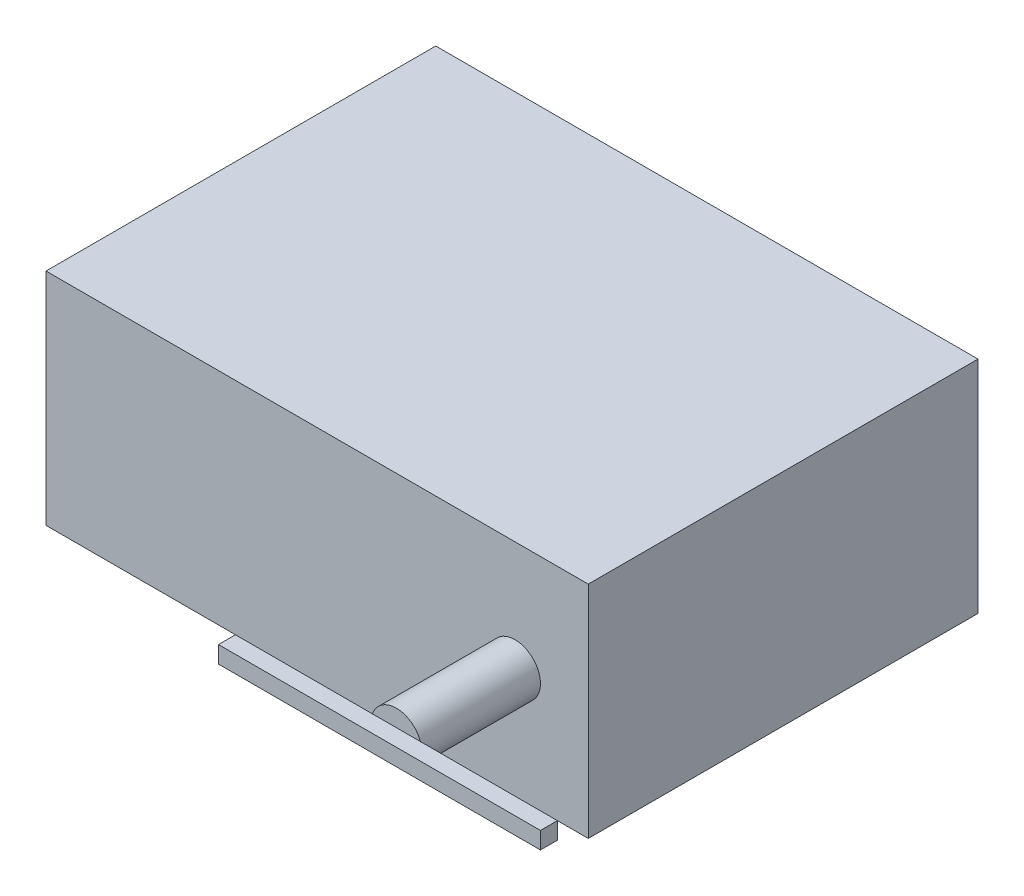
ISO-10303-21;
HEADER;
FILE_DESCRIPTION(('STEP AP214'),'2;1');
FILE_NAME('part.step','',(''),(''),'','','');
FILE_SCHEMA(('AUTOMOTIVE_DESIGN { 1 0 10303 214 1 1 1 1 }'));
ENDSEC;
DATA;
#1=APPLICATION_CONTEXT('core data for automotive mechanical design processes');
#2=APPLICATION_PROTOCOL_DEFINITION('international standard','automotive_design',2000,#1);
#3=PRODUCT_CONTEXT('',#1,'mechanical');
#4=PRODUCT('Part','Part','',(#3));
#5=PRODUCT_RELATED_PRODUCT_CATEGORY('part','',(#4));
#6=PRODUCT_DEFINITION_FORMATION('','',#4);
#7=PRODUCT_DEFINITION_CONTEXT('part definition',#1,'design');
#8=PRODUCT_DEFINITION('design','',#6,#7);
#9=PRODUCT_DEFINITION_SHAPE('','',#8);
#10=(LENGTH_UNIT() NAMED_UNIT(*) SI_UNIT(.MILLI.,.METRE.));
#11=(NAMED_UNIT(*) PLANE_ANGLE_UNIT() SI_UNIT($,.RADIAN.));
#12=(NAMED_UNIT(*) SI_UNIT($,.STERADIAN.) SOLID_ANGLE_UNIT());
#13=UNCERTAINTY_MEASURE_WITH_UNIT(LENGTH_MEASURE(1.E-05),#10,'distance_accuracy_value','');
#14=(GEOMETRIC_REPRESENTATION_CONTEXT(3) GLOBAL_UNCERTAINTY_ASSIGNED_CONTEXT((#13)) GLOBAL_UNIT_ASSIGNED_CONTEXT((#10,
#11,#12)) REPRESENTATION_CONTEXT('',''));
#15=CARTESIAN_POINT('',(0.,0.,0.));
#16=DIRECTION('',(0.,0.,1.));
#17=DIRECTION('',(1.,0.,0.));
#18=AXIS2_PLACEMENT_3D('',#15,#16,#17);
#19=CARTESIAN_POINT('',(27.6786885669575,6.5,30.));
#20=DIRECTION('',(0.,0.,1.));
#21=DIRECTION('',(1.,0.,0.));
#22=AXIS2_PLACEMENT_3D('',#19,#20,#21);
#23=PLANE('',#22);
#24=DIRECTION('',(-1.,0.,0.));
#25=VECTOR('',#24,1.);
#26=CARTESIAN_POINT('',(27.6786885669575,7.,30.));
#27=LINE('',#26,#25);
#28=CARTESIAN_POINT('',(29.0929021293306,7.,30.));
#29=VERTEX_POINT('',#28);
#30=CARTESIAN_POINT('',(26.2644750045844,7.,30.));
#31=VERTEX_POINT('',#30);
#32=EDGE_CURVE('E155',#29,#31,#27,.T.);
#33=ORIENTED_EDGE('',*,*,#32,.F.);
#34=CARTESIAN_POINT('',(27.6786885669575,6.5,30.));
#35=DIRECTION('',(0.,0.,1.));
#36=DIRECTION('',(1.,0.,0.));
#37=AXIS2_PLACEMENT_3D('',#34,#35,#36);
#38=CIRCLE('',#37,1.5);
#39=EDGE_CURVE('E58',#29,#31,#38,.T.);
#40=ORIENTED_EDGE('',*,*,#39,.T.);
#41=EDGE_LOOP('',(#33,#40));
#42=FACE_BOUND('',#41,.T.);
#43=ADVANCED_FACE('F37',(#42),#23,.T.);
#44=CARTESIAN_POINT('',(0.,13.,23.));
#45=DIRECTION('',(1.,0.,0.));
#46=DIRECTION('',(0.,1.,0.));
#47=AXIS2_PLACEMENT_3D('',#44,#45,#46);
#48=PLANE('',#47);
#49=DIRECTION('',(0.,-1.,0.));
#50=VECTOR('',#49,1.);
#51=CARTESIAN_POINT('',(0.,13.,0.));
#52=LINE('',#51,#50);
#53=CARTESIAN_POINT('',(0.,13.,0.));
#54=VERTEX_POINT('',#53);
#55=CARTESIAN_POINT('',(0.,0.,0.));
#56=VERTEX_POINT('',#55);
#57=EDGE_CURVE('E168',#54,#56,#52,.T.);
#58=ORIENTED_EDGE('',*,*,#57,.T.);
#59=DIRECTION('',(0.,0.,-1.));
#60=VECTOR('',#59,1.);
#61=CARTESIAN_POINT('',(0.,0.,23.));
#62=LINE('',#61,#60);
#63=CARTESIAN_POINT('',(0.,0.,23.));
#64=VERTEX_POINT('',#63);
#65=EDGE_CURVE('E41',#64,#56,#62,.T.);
#66=ORIENTED_EDGE('',*,*,#65,.F.);
#67=DIRECTION('',(0.,-1.,0.));
#68=VECTOR('',#67,1.);
#69=CARTESIAN_POINT('',(0.,13.,23.));
#70=LINE('',#69,#68);
#71=CARTESIAN_POINT('',(0.,13.,23.));
#72=VERTEX_POINT('',#71);
#73=EDGE_CURVE('E172',#72,#64,#70,.T.);
#74=ORIENTED_EDGE('',*,*,#73,.F.);
#75=DIRECTION('',(0.,0.,-1.));
#76=VECTOR('',#75,1.);
#77=CARTESIAN_POINT('',(0.,13.,23.));
#78=LINE('',#77,#76);
#79=EDGE_CURVE('E182',#72,#54,#78,.T.);
#80=ORIENTED_EDGE('',*,*,#79,.T.);
#81=EDGE_LOOP('',(#58,#66,#74,#80));
#82=FACE_BOUND('',#81,.T.);
#83=ADVANCED_FACE('F39',(#82),#48,.F.);
#84=CARTESIAN_POINT('',(0.,0.,23.));
#85=DIRECTION('',(0.,1.,0.));
#86=DIRECTION('',(0.,0.,1.));
#87=AXIS2_PLACEMENT_3D('',#84,#85,#86);
#88=PLANE('',#87);
#89=DIRECTION('',(1.,0.,0.));
#90=VECTOR('',#89,1.);
#91=CARTESIAN_POINT('',(0.,0.,0.));
#92=LINE('',#91,#90);
#93=CARTESIAN_POINT('',(32.,0.,0.));
#94=VERTEX_POINT('',#93);
#95=EDGE_CURVE('E185',#56,#94,#92,.T.);
#96=ORIENTED_EDGE('',*,*,#95,.T.);
#97=DIRECTION('',(0.,0.,-1.));
#98=VECTOR('',#97,1.);
#99=CARTESIAN_POINT('',(32.,0.,23.));
#100=LINE('',#99,#98);
#101=CARTESIAN_POINT('',(32.,0.,23.));
#102=VERTEX_POINT('',#101);
#103=EDGE_CURVE('E194',#102,#94,#100,.T.);
#104=ORIENTED_EDGE('',*,*,#103,.F.);
#105=DIRECTION('',(1.,0.,0.));
#106=VECTOR('',#105,1.);
#107=CARTESIAN_POINT('',(0.,0.,23.));
#108=LINE('',#107,#106);
#109=EDGE_CURVE('E175',#64,#102,#108,.T.);
#110=ORIENTED_EDGE('',*,*,#109,.F.);
#111=ORIENTED_EDGE('',*,*,#65,.T.);
#112=EDGE_LOOP('',(#96,#104,#110,#111));
#113=FACE_BOUND('',#112,.T.);
#114=ADVANCED_FACE('F203',(#113),#88,.F.);
#115=CARTESIAN_POINT('',(32.,0.,23.));
#116=DIRECTION('',(-1.,0.,0.));
#117=DIRECTION('',(0.,0.,1.));
#118=AXIS2_PLACEMENT_3D('',#115,#116,#117);
#119=PLANE('',#118);
#120=DIRECTION('',(0.,1.,0.));
#121=VECTOR('',#120,1.);
#122=CARTESIAN_POINT('',(32.,0.,0.));
#123=LINE('',#122,#121);
#124=CARTESIAN_POINT('',(32.,13.,0.));
#125=VERTEX_POINT('',#124);
#126=EDGE_CURVE('E187',#94,#125,#123,.T.);
#127=ORIENTED_EDGE('',*,*,#126,.T.);
#128=DIRECTION('',(0.,0.,-1.));
#129=VECTOR('',#128,1.);
#130=CARTESIAN_POINT('',(32.,13.,23.));
#131=LINE('',#130,#129);
#132=CARTESIAN_POINT('',(32.,13.,23.));
#133=VERTEX_POINT('',#132);
#134=EDGE_CURVE('E192',#133,#125,#131,.T.);
#135=ORIENTED_EDGE('',*,*,#134,.F.);
#136=DIRECTION('',(0.,1.,0.));
#137=VECTOR('',#136,1.);
#138=CARTESIAN_POINT('',(32.,0.,23.));
#139=LINE('',#138,#137);
#140=EDGE_CURVE('E178',#102,#133,#139,.T.);
#141=ORIENTED_EDGE('',*,*,#140,.F.);
#142=ORIENTED_EDGE('',*,*,#103,.T.);
#143=EDGE_LOOP('',(#127,#135,#141,#142));
#144=FACE_BOUND('',#143,.T.);
#145=ADVANCED_FACE('F212',(#144),#119,.F.);
#146=CARTESIAN_POINT('',(32.,13.,23.));
#147=DIRECTION('',(0.,-1.,0.));
#148=DIRECTION('',(1.,0.,0.));
#149=AXIS2_PLACEMENT_3D('',#146,#147,#148);
#150=PLANE('',#149);
#151=DIRECTION('',(-1.,0.,0.));
#152=VECTOR('',#151,1.);
#153=CARTESIAN_POINT('',(32.,13.,0.));
#154=LINE('',#153,#152);
#155=EDGE_CURVE('E176',#125,#54,#154,.T.);
#156=ORIENTED_EDGE('',*,*,#155,.T.);
#157=ORIENTED_EDGE('',*,*,#79,.F.);
#158=DIRECTION('',(-1.,0.,0.));
#159=VECTOR('',#158,1.);
#160=CARTESIAN_POINT('',(32.,13.,23.));
#161=LINE('',#160,#159);
#162=EDGE_CURVE('E180',#133,#72,#161,.T.);
#163=ORIENTED_EDGE('',*,*,#162,.F.);
#164=ORIENTED_EDGE('',*,*,#134,.T.);
#165=EDGE_LOOP('',(#156,#157,#163,#164));
#166=FACE_BOUND('',#165,.T.);
#167=ADVANCED_FACE('F215',(#166),#150,.F.);
#168=CARTESIAN_POINT('',(0.,0.,23.));
#169=DIRECTION('',(0.,0.,1.));
#170=DIRECTION('',(1.,0.,0.));
#171=AXIS2_PLACEMENT_3D('',#168,#169,#170);
#172=PLANE('',#171);
#173=CARTESIAN_POINT('',(27.6786885669575,6.5,23.));
#174=DIRECTION('',(0.,0.,1.));
#175=DIRECTION('',(1.,0.,0.));
#176=AXIS2_PLACEMENT_3D('',#173,#174,#175);
#177=CIRCLE('',#176,1.5);
#178=CARTESIAN_POINT('',(29.1786885669575,6.5,23.));
#179=VERTEX_POINT('',#178);
#180=EDGE_CURVE('E164',#179,#179,#177,.T.);
#181=ORIENTED_EDGE('',*,*,#180,.F.);
#182=EDGE_LOOP('',(#181));
#183=FACE_BOUND('',#182,.T.);
#184=ORIENTED_EDGE('',*,*,#73,.T.);
#185=ORIENTED_EDGE('',*,*,#109,.T.);
#186=ORIENTED_EDGE('',*,*,#140,.T.);
#187=ORIENTED_EDGE('',*,*,#162,.T.);
#188=EDGE_LOOP('',(#184,#185,#186,#187));
#189=FACE_BOUND('',#188,.T.);
#190=ADVANCED_FACE('F217',(#183,#189),#172,.T.);
#191=CARTESIAN_POINT('',(0.,0.,0.));
#192=DIRECTION('',(0.,0.,1.));
#193=DIRECTION('',(1.,0.,0.));
#194=AXIS2_PLACEMENT_3D('',#191,#192,#193);
#195=PLANE('',#194);
#196=ORIENTED_EDGE('',*,*,#57,.F.);
#197=ORIENTED_EDGE('',*,*,#155,.F.);
#198=ORIENTED_EDGE('',*,*,#126,.F.);
#199=ORIENTED_EDGE('',*,*,#95,.F.);
#200=EDGE_LOOP('',(#196,#197,#198,#199));
#201=FACE_BOUND('',#200,.T.);
#202=ADVANCED_FACE('F210',(#201),#195,.F.);
#203=CARTESIAN_POINT('',(27.6786885669575,6.5,30.));
#204=DIRECTION('',(0.,0.,-1.));
#205=DIRECTION('',(-1.,0.,0.));
#206=AXIS2_PLACEMENT_3D('',#203,#204,#205);
#207=CYLINDRICAL_SURFACE('',#206,1.5);
#208=CARTESIAN_POINT('',(26.2644750045844,6.,30.));
#209=VERTEX_POINT('',#208);
#210=EDGE_CURVE('E165',#31,#209,#38,.T.);
#211=ORIENTED_EDGE('',*,*,#210,.F.);
#212=ORIENTED_EDGE('',*,*,#39,.F.);
#213=CARTESIAN_POINT('',(27.6786885669575,6.5,30.));
#214=DIRECTION('',(0.,0.,-1.));
#215=DIRECTION('',(-1.,0.,0.));
#216=AXIS2_PLACEMENT_3D('',#213,#214,#215);
#217=CIRCLE('',#216,1.5);
#218=CARTESIAN_POINT('',(29.0929021293306,6.,30.));
#219=VERTEX_POINT('',#218);
#220=EDGE_CURVE('E135',#29,#219,#217,.T.);
#221=ORIENTED_EDGE('',*,*,#220,.T.);
#222=EDGE_CURVE('E169',#209,#219,#38,.T.);
#223=ORIENTED_EDGE('',*,*,#222,.F.);
#224=EDGE_LOOP('',(#211,#212,#221,#223));
#225=FACE_BOUND('',#224,.T.);
#226=ORIENTED_EDGE('',*,*,#180,.T.);
#227=EDGE_LOOP('',(#226));
#228=FACE_BOUND('',#227,.T.);
#229=ADVANCED_FACE('F225',(#225,#228),#207,.T.);
#230=ORIENTED_EDGE('',*,*,#222,.T.);
#231=DIRECTION('',(1.,0.,0.));
#232=VECTOR('',#231,1.);
#233=CARTESIAN_POINT('',(27.6786885669575,6.,30.));
#234=LINE('',#233,#232);
#235=EDGE_CURVE('E11',#209,#219,#234,.T.);
#236=ORIENTED_EDGE('',*,*,#235,.F.);
#237=EDGE_LOOP('',(#230,#236));
#238=FACE_BOUND('',#237,.T.);
#239=ADVANCED_FACE('F232',(#238),#23,.T.);
#240=CARTESIAN_POINT('',(27.6786885669575,7.,31.));
#241=DIRECTION('',(0.,-1.,0.));
#242=DIRECTION('',(1.,0.,0.));
#243=AXIS2_PLACEMENT_3D('',#240,#241,#242);
#244=PLANE('',#243);
#245=ORIENTED_EDGE('',*,*,#32,.T.);
#246=CARTESIAN_POINT('',(18.1786885669575,7.,30.));
#247=VERTEX_POINT('',#246);
#248=EDGE_CURVE('E151',#31,#247,#27,.T.);
#249=ORIENTED_EDGE('',*,*,#248,.T.);
#250=DIRECTION('',(0.,0.,-1.));
#251=VECTOR('',#250,1.);
#252=CARTESIAN_POINT('',(18.1786885669575,7.,31.));
#253=LINE('',#252,#251);
#254=CARTESIAN_POINT('',(18.1786885669575,7.,31.));
#255=VERTEX_POINT('',#254);
#256=EDGE_CURVE('E161',#255,#247,#253,.T.);
#257=ORIENTED_EDGE('',*,*,#256,.F.);
#258=DIRECTION('',(-1.,0.,0.));
#259=VECTOR('',#258,1.);
#260=CARTESIAN_POINT('',(27.6786885669575,7.,31.));
#261=LINE('',#260,#259);
#262=CARTESIAN_POINT('',(37.1786885669575,7.,31.));
#263=VERTEX_POINT('',#262);
#264=EDGE_CURVE('E152',#263,#255,#261,.T.);
#265=ORIENTED_EDGE('',*,*,#264,.F.);
#266=DIRECTION('',(0.,0.,-1.));
#267=VECTOR('',#266,1.);
#268=CARTESIAN_POINT('',(37.1786885669575,7.,31.));
#269=LINE('',#268,#267);
#270=CARTESIAN_POINT('',(37.1786885669575,7.,30.));
#271=VERTEX_POINT('',#270);
#272=EDGE_CURVE('E136',#263,#271,#269,.T.);
#273=ORIENTED_EDGE('',*,*,#272,.T.);
#274=DIRECTION('',(1.,0.,0.));
#275=VECTOR('',#274,1.);
#276=CARTESIAN_POINT('',(27.6786885669575,7.,30.));
#277=LINE('',#276,#275);
#278=EDGE_CURVE('E146',#29,#271,#277,.T.);
#279=ORIENTED_EDGE('',*,*,#278,.F.);
#280=EDGE_LOOP('',(#245,#249,#257,#265,#273,#279));
#281=FACE_BOUND('',#280,.T.);
#282=ADVANCED_FACE('F238',(#281),#244,.F.);
#283=CARTESIAN_POINT('',(18.1786885669575,6.,31.));
#284=DIRECTION('',(1.,0.,0.));
#285=DIRECTION('',(0.,0.,-1.));
#286=AXIS2_PLACEMENT_3D('',#283,#284,#285);
#287=PLANE('',#286);
#288=DIRECTION('',(0.,-1.,0.));
#289=VECTOR('',#288,1.);
#290=CARTESIAN_POINT('',(18.1786885669575,6.,30.));
#291=LINE('',#290,#289);
#292=CARTESIAN_POINT('',(18.1786885669575,6.,30.));
#293=VERTEX_POINT('',#292);
#294=EDGE_CURVE('E158',#247,#293,#291,.T.);
#295=ORIENTED_EDGE('',*,*,#294,.T.);
#296=DIRECTION('',(0.,0.,-1.));
#297=VECTOR('',#296,1.);
#298=CARTESIAN_POINT('',(18.1786885669575,6.,31.));
#299=LINE('',#298,#297);
#300=CARTESIAN_POINT('',(18.1786885669575,6.,31.));
#301=VERTEX_POINT('',#300);
#302=EDGE_CURVE('E124',#301,#293,#299,.T.);
#303=ORIENTED_EDGE('',*,*,#302,.F.);
#304=DIRECTION('',(0.,-1.,0.));
#305=VECTOR('',#304,1.);
#306=CARTESIAN_POINT('',(18.1786885669575,6.,31.));
#307=LINE('',#306,#305);
#308=EDGE_CURVE('E120',#255,#301,#307,.T.);
#309=ORIENTED_EDGE('',*,*,#308,.F.);
#310=ORIENTED_EDGE('',*,*,#256,.T.);
#311=EDGE_LOOP('',(#295,#303,#309,#310));
#312=FACE_BOUND('',#311,.T.);
#313=ADVANCED_FACE('F243',(#312),#287,.F.);
#314=CARTESIAN_POINT('',(27.6786885669575,6.,31.));
#315=DIRECTION('',(0.,1.,0.));
#316=DIRECTION('',(-1.,0.,0.));
#317=AXIS2_PLACEMENT_3D('',#314,#315,#316);
#318=PLANE('',#317);
#319=EDGE_CURVE('E47',#293,#209,#234,.T.);
#320=ORIENTED_EDGE('',*,*,#319,.T.);
#321=ORIENTED_EDGE('',*,*,#235,.T.);
#322=DIRECTION('',(-1.,0.,0.));
#323=VECTOR('',#322,1.);
#324=CARTESIAN_POINT('',(27.6786885669575,6.,30.));
#325=LINE('',#324,#323);
#326=CARTESIAN_POINT('',(37.1786885669575,6.,30.));
#327=VERTEX_POINT('',#326);
#328=EDGE_CURVE('E131',#327,#219,#325,.T.);
#329=ORIENTED_EDGE('',*,*,#328,.F.);
#330=DIRECTION('',(0.,0.,-1.));
#331=VECTOR('',#330,1.);
#332=CARTESIAN_POINT('',(37.1786885669575,6.,31.));
#333=LINE('',#332,#331);
#334=CARTESIAN_POINT('',(37.1786885669575,6.,31.));
#335=VERTEX_POINT('',#334);
#336=EDGE_CURVE('E127',#335,#327,#333,.T.);
#337=ORIENTED_EDGE('',*,*,#336,.F.);
#338=DIRECTION('',(1.,0.,0.));
#339=VECTOR('',#338,1.);
#340=CARTESIAN_POINT('',(27.6786885669575,6.,31.));
#341=LINE('',#340,#339);
#342=EDGE_CURVE('E114',#301,#335,#341,.T.);
#343=ORIENTED_EDGE('',*,*,#342,.F.);
#344=ORIENTED_EDGE('',*,*,#302,.T.);
#345=EDGE_LOOP('',(#320,#321,#329,#337,#343,#344));
#346=FACE_BOUND('',#345,.T.);
#347=ADVANCED_FACE('F129',(#346),#318,.F.);
#348=CARTESIAN_POINT('',(0.,0.,31.));
#349=DIRECTION('',(0.,0.,-1.));
#350=DIRECTION('',(-1.,0.,0.));
#351=AXIS2_PLACEMENT_3D('',#348,#349,#350);
#352=PLANE('',#351);
#353=ORIENTED_EDGE('',*,*,#264,.T.);
#354=ORIENTED_EDGE('',*,*,#308,.T.);
#355=ORIENTED_EDGE('',*,*,#342,.T.);
#356=DIRECTION('',(0.,-1.,0.));
#357=VECTOR('',#356,1.);
#358=CARTESIAN_POINT('',(37.1786885669575,6.,31.));
#359=LINE('',#358,#357);
#360=EDGE_CURVE('E119',#263,#335,#359,.T.);
#361=ORIENTED_EDGE('',*,*,#360,.F.);
#362=EDGE_LOOP('',(#353,#354,#355,#361));
#363=FACE_BOUND('',#362,.T.);
#364=ADVANCED_FACE('F117',(#363),#352,.F.);
#365=CARTESIAN_POINT('',(0.,0.,30.));
#366=DIRECTION('',(0.,0.,-1.));
#367=DIRECTION('',(-1.,0.,0.));
#368=AXIS2_PLACEMENT_3D('',#365,#366,#367);
#369=PLANE('',#368);
#370=ORIENTED_EDGE('',*,*,#248,.F.);
#371=ORIENTED_EDGE('',*,*,#210,.T.);
#372=ORIENTED_EDGE('',*,*,#319,.F.);
#373=ORIENTED_EDGE('',*,*,#294,.F.);
#374=EDGE_LOOP('',(#370,#371,#372,#373));
#375=FACE_BOUND('',#374,.T.);
#376=ADVANCED_FACE('F251',(#375),#369,.T.);
#377=CARTESIAN_POINT('',(55.3573771339151,0.,30.));
#378=DIRECTION('',(0.,0.,-1.));
#379=DIRECTION('',(1.,0.,0.));
#380=AXIS2_PLACEMENT_3D('',#377,#378,#379);
#381=PLANE('',#380);
#382=ORIENTED_EDGE('',*,*,#220,.F.);
#383=ORIENTED_EDGE('',*,*,#278,.T.);
#384=DIRECTION('',(0.,-1.,0.));
#385=VECTOR('',#384,1.);
#386=CARTESIAN_POINT('',(37.1786885669575,6.,30.));
#387=LINE('',#386,#385);
#388=EDGE_CURVE('E141',#271,#327,#387,.T.);
#389=ORIENTED_EDGE('',*,*,#388,.T.);
#390=ORIENTED_EDGE('',*,*,#328,.T.);
#391=EDGE_LOOP('',(#382,#383,#389,#390));
#392=FACE_BOUND('',#391,.T.);
#393=ADVANCED_FACE('F257',(#392),#381,.T.);
#394=CARTESIAN_POINT('',(37.1786885669575,6.,31.));
#395=DIRECTION('',(1.,0.,0.));
#396=DIRECTION('',(0.,0.,-1.));
#397=AXIS2_PLACEMENT_3D('',#394,#395,#396);
#398=PLANE('',#397);
#399=ORIENTED_EDGE('',*,*,#388,.F.);
#400=ORIENTED_EDGE('',*,*,#272,.F.);
#401=ORIENTED_EDGE('',*,*,#360,.T.);
#402=ORIENTED_EDGE('',*,*,#336,.T.);
#403=EDGE_LOOP('',(#399,#400,#401,#402));
#404=FACE_BOUND('',#403,.T.);
#405=ADVANCED_FACE('F139',(#404),#398,.T.);
#406=CLOSED_SHELL('',(#43,#83,#114,#145,#167,#190,#202,#229,#239,#282,#313,#347,#364,#376,#393,#405));
#407=MANIFOLD_SOLID_BREP('B2',#406);
#408=ADVANCED_BREP_SHAPE_REPRESENTATION('',(#18,#407),#14);
#409=SHAPE_DEFINITION_REPRESENTATION(#9,#408);
ENDSEC;
END-ISO-10303-21;
